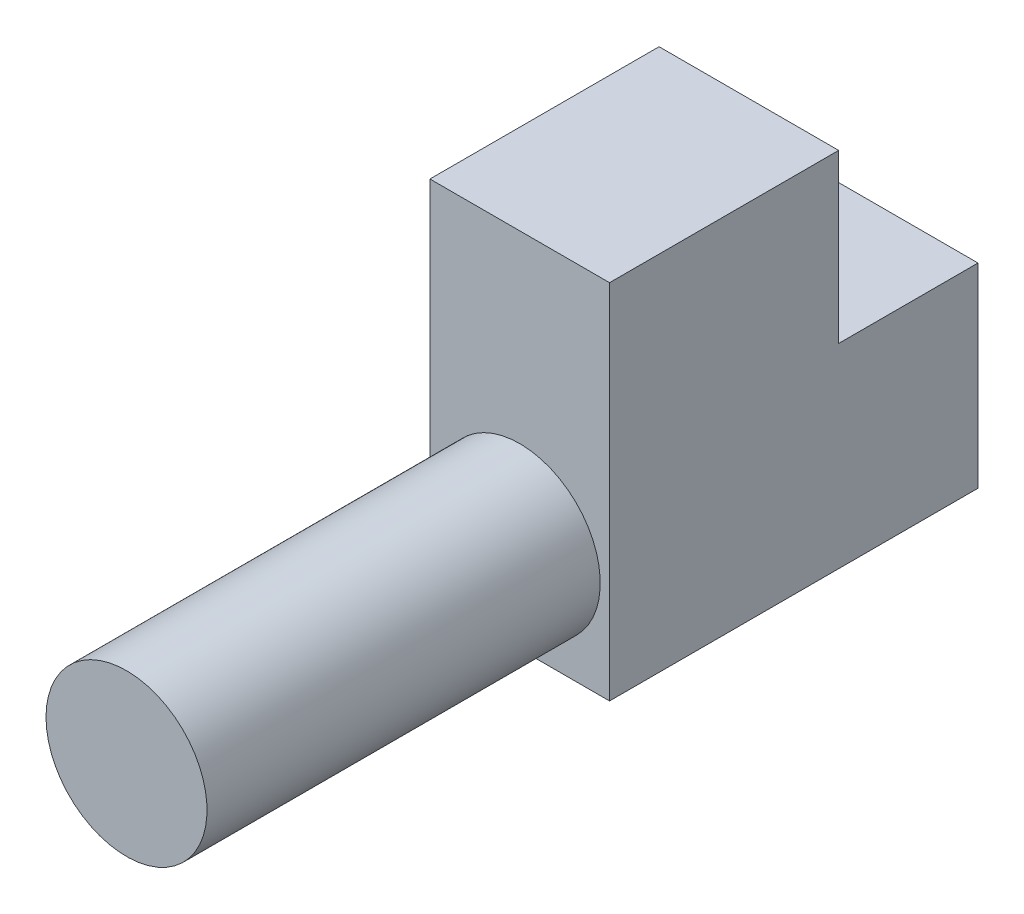
ISO-10303-21;
HEADER;
FILE_DESCRIPTION(('STEP AP214'),'2;1');
FILE_NAME('part.step','',(''),(''),'','','');
FILE_SCHEMA(('AUTOMOTIVE_DESIGN { 1 0 10303 214 1 1 1 1 }'));
ENDSEC;
DATA;
#1=APPLICATION_CONTEXT('core data for automotive mechanical design processes');
#2=APPLICATION_PROTOCOL_DEFINITION('international standard','automotive_design',2000,#1);
#3=PRODUCT_CONTEXT('',#1,'mechanical');
#4=PRODUCT('Part','Part','',(#3));
#5=PRODUCT_RELATED_PRODUCT_CATEGORY('part','',(#4));
#6=PRODUCT_DEFINITION_FORMATION('','',#4);
#7=PRODUCT_DEFINITION_CONTEXT('part definition',#1,'design');
#8=PRODUCT_DEFINITION('design','',#6,#7);
#9=PRODUCT_DEFINITION_SHAPE('','',#8);
#10=(LENGTH_UNIT() NAMED_UNIT(*) SI_UNIT(.MILLI.,.METRE.));
#11=(NAMED_UNIT(*) PLANE_ANGLE_UNIT() SI_UNIT($,.RADIAN.));
#12=(NAMED_UNIT(*) SI_UNIT($,.STERADIAN.) SOLID_ANGLE_UNIT());
#13=UNCERTAINTY_MEASURE_WITH_UNIT(LENGTH_MEASURE(1.E-05),#10,'distance_accuracy_value','');
#14=(GEOMETRIC_REPRESENTATION_CONTEXT(3) GLOBAL_UNCERTAINTY_ASSIGNED_CONTEXT((#13)) GLOBAL_UNIT_ASSIGNED_CONTEXT((#10,
#11,#12)) REPRESENTATION_CONTEXT('',''));
#15=CARTESIAN_POINT('',(0.,0.,0.));
#16=DIRECTION('',(0.,0.,1.));
#17=DIRECTION('',(1.,0.,0.));
#18=AXIS2_PLACEMENT_3D('',#15,#16,#17);
#19=CARTESIAN_POINT('',(-14.5,15.75,59.5));
#20=DIRECTION('',(0.,-1.,0.));
#21=DIRECTION('',(0.,0.,-1.));
#22=AXIS2_PLACEMENT_3D('',#19,#20,#21);
#23=PLANE('',#22);
#24=DIRECTION('',(-1.,0.,0.));
#25=VECTOR('',#24,1.);
#26=CARTESIAN_POINT('',(-14.5,15.75,22.5));
#27=LINE('',#26,#25);
#28=CARTESIAN_POINT('',(14.5,15.75,22.5));
#29=VERTEX_POINT('',#28);
#30=CARTESIAN_POINT('',(-14.5,15.75,22.5));
#31=VERTEX_POINT('',#30);
#32=EDGE_CURVE('E46',#29,#31,#27,.T.);
#33=ORIENTED_EDGE('',*,*,#32,.F.);
#34=DIRECTION('',(0.,0.,-1.));
#35=VECTOR('',#34,1.);
#36=CARTESIAN_POINT('',(14.5,15.75,59.5));
#37=LINE('',#36,#35);
#38=CARTESIAN_POINT('',(14.5,15.75,0.));
#39=VERTEX_POINT('',#38);
#40=EDGE_CURVE('E11',#29,#39,#37,.T.);
#41=ORIENTED_EDGE('',*,*,#40,.T.);
#42=DIRECTION('',(-1.,0.,0.));
#43=VECTOR('',#42,1.);
#44=CARTESIAN_POINT('',(-14.5,15.75,0.));
#45=LINE('',#44,#43);
#46=CARTESIAN_POINT('',(-14.5,15.75,0.));
#47=VERTEX_POINT('',#46);
#48=EDGE_CURVE('E94',#39,#47,#45,.T.);
#49=ORIENTED_EDGE('',*,*,#48,.T.);
#50=DIRECTION('',(0.,0.,-1.));
#51=VECTOR('',#50,1.);
#52=CARTESIAN_POINT('',(-14.5,15.75,59.5));
#53=LINE('',#52,#51);
#54=EDGE_CURVE('E40',#31,#47,#53,.T.);
#55=ORIENTED_EDGE('',*,*,#54,.F.);
#56=EDGE_LOOP('',(#33,#41,#49,#55));
#57=FACE_BOUND('',#56,.T.);
#58=ADVANCED_FACE('F32',(#57),#23,.F.);
#59=CARTESIAN_POINT('',(14.5,-15.75,59.5));
#60=DIRECTION('',(-1.,0.,0.));
#61=DIRECTION('',(0.,0.,1.));
#62=AXIS2_PLACEMENT_3D('',#59,#60,#61);
#63=PLANE('',#62);
#64=DIRECTION('',(0.,1.,0.));
#65=VECTOR('',#64,1.);
#66=CARTESIAN_POINT('',(14.5,-15.75,0.));
#67=LINE('',#66,#65);
#68=CARTESIAN_POINT('',(14.5,-15.75,0.));
#69=VERTEX_POINT('',#68);
#70=EDGE_CURVE('E88',#69,#39,#67,.T.);
#71=ORIENTED_EDGE('',*,*,#70,.T.);
#72=ORIENTED_EDGE('',*,*,#40,.F.);
#73=DIRECTION('',(0.,-1.,0.));
#74=VECTOR('',#73,1.);
#75=CARTESIAN_POINT('',(14.5,42.75,22.5));
#76=LINE('',#75,#74);
#77=CARTESIAN_POINT('',(14.5,42.75,22.5));
#78=VERTEX_POINT('',#77);
#79=EDGE_CURVE('E95',#78,#29,#76,.T.);
#80=ORIENTED_EDGE('',*,*,#79,.F.);
#81=DIRECTION('',(0.,0.,-1.));
#82=VECTOR('',#81,1.);
#83=CARTESIAN_POINT('',(14.5,42.75,59.5));
#84=LINE('',#83,#82);
#85=CARTESIAN_POINT('',(14.5,42.75,59.5));
#86=VERTEX_POINT('',#85);
#87=EDGE_CURVE('E124',#86,#78,#84,.T.);
#88=ORIENTED_EDGE('',*,*,#87,.F.);
#89=DIRECTION('',(0.,1.,0.));
#90=VECTOR('',#89,1.);
#91=CARTESIAN_POINT('',(14.5,-15.75,59.5));
#92=LINE('',#91,#90);
#93=CARTESIAN_POINT('',(14.5,-15.75,59.5));
#94=VERTEX_POINT('',#93);
#95=EDGE_CURVE('E83',#94,#86,#92,.T.);
#96=ORIENTED_EDGE('',*,*,#95,.F.);
#97=DIRECTION('',(0.,0.,-1.));
#98=VECTOR('',#97,1.);
#99=CARTESIAN_POINT('',(14.5,-15.75,59.5));
#100=LINE('',#99,#98);
#101=EDGE_CURVE('E76',#94,#69,#100,.T.);
#102=ORIENTED_EDGE('',*,*,#101,.T.);
#103=EDGE_LOOP('',(#71,#72,#80,#88,#96,#102));
#104=FACE_BOUND('',#103,.T.);
#105=ADVANCED_FACE('F34',(#104),#63,.F.);
#106=CARTESIAN_POINT('',(-14.5,-15.75,59.5));
#107=DIRECTION('',(1.,0.,0.));
#108=DIRECTION('',(0.,0.,-1.));
#109=AXIS2_PLACEMENT_3D('',#106,#107,#108);
#110=PLANE('',#109);
#111=DIRECTION('',(0.,-1.,0.));
#112=VECTOR('',#111,1.);
#113=CARTESIAN_POINT('',(-14.5,-15.75,0.));
#114=LINE('',#113,#112);
#115=CARTESIAN_POINT('',(-14.5,-15.75,0.));
#116=VERTEX_POINT('',#115);
#117=EDGE_CURVE('E84',#47,#116,#114,.T.);
#118=ORIENTED_EDGE('',*,*,#117,.T.);
#119=DIRECTION('',(0.,0.,-1.));
#120=VECTOR('',#119,1.);
#121=CARTESIAN_POINT('',(-14.5,-15.75,59.5));
#122=LINE('',#121,#120);
#123=CARTESIAN_POINT('',(-14.5,-15.75,59.5));
#124=VERTEX_POINT('',#123);
#125=EDGE_CURVE('E79',#124,#116,#122,.T.);
#126=ORIENTED_EDGE('',*,*,#125,.F.);
#127=DIRECTION('',(0.,-1.,0.));
#128=VECTOR('',#127,1.);
#129=CARTESIAN_POINT('',(-14.5,-15.75,59.5));
#130=LINE('',#129,#128);
#131=CARTESIAN_POINT('',(-14.5,42.75,59.5));
#132=VERTEX_POINT('',#131);
#133=EDGE_CURVE('E140',#132,#124,#130,.T.);
#134=ORIENTED_EDGE('',*,*,#133,.F.);
#135=DIRECTION('',(0.,0.,1.));
#136=VECTOR('',#135,1.);
#137=CARTESIAN_POINT('',(-14.5,42.75,59.5));
#138=LINE('',#137,#136);
#139=CARTESIAN_POINT('',(-14.5,42.75,22.5));
#140=VERTEX_POINT('',#139);
#141=EDGE_CURVE('E123',#140,#132,#138,.T.);
#142=ORIENTED_EDGE('',*,*,#141,.F.);
#143=DIRECTION('',(0.,-1.,0.));
#144=VECTOR('',#143,1.);
#145=CARTESIAN_POINT('',(-14.5,42.75,22.5));
#146=LINE('',#145,#144);
#147=EDGE_CURVE('E99',#140,#31,#146,.T.);
#148=ORIENTED_EDGE('',*,*,#147,.T.);
#149=ORIENTED_EDGE('',*,*,#54,.T.);
#150=EDGE_LOOP('',(#118,#126,#134,#142,#148,#149));
#151=FACE_BOUND('',#150,.T.);
#152=ADVANCED_FACE('F107',(#151),#110,.F.);
#153=CARTESIAN_POINT('',(-14.5,-15.75,59.5));
#154=DIRECTION('',(0.,1.,0.));
#155=DIRECTION('',(0.,0.,1.));
#156=AXIS2_PLACEMENT_3D('',#153,#154,#155);
#157=PLANE('',#156);
#158=DIRECTION('',(1.,0.,0.));
#159=VECTOR('',#158,1.);
#160=CARTESIAN_POINT('',(-14.5,-15.75,0.));
#161=LINE('',#160,#159);
#162=EDGE_CURVE('E73',#116,#69,#161,.T.);
#163=ORIENTED_EDGE('',*,*,#162,.T.);
#164=ORIENTED_EDGE('',*,*,#101,.F.);
#165=DIRECTION('',(1.,0.,0.));
#166=VECTOR('',#165,1.);
#167=CARTESIAN_POINT('',(-14.5,-15.75,59.5));
#168=LINE('',#167,#166);
#169=EDGE_CURVE('E55',#124,#94,#168,.T.);
#170=ORIENTED_EDGE('',*,*,#169,.F.);
#171=ORIENTED_EDGE('',*,*,#125,.T.);
#172=EDGE_LOOP('',(#163,#164,#170,#171));
#173=FACE_BOUND('',#172,.T.);
#174=ADVANCED_FACE('F75',(#173),#157,.F.);
#175=CARTESIAN_POINT('',(0.,0.,59.5));
#176=DIRECTION('',(0.,0.,-1.));
#177=DIRECTION('',(-1.,0.,0.));
#178=AXIS2_PLACEMENT_3D('',#175,#176,#177);
#179=PLANE('',#178);
#180=CARTESIAN_POINT('',(0.,0.,59.5));
#181=DIRECTION('',(0.,0.,-1.));
#182=DIRECTION('',(-1.,0.,0.));
#183=AXIS2_PLACEMENT_3D('',#180,#181,#182);
#184=CIRCLE('',#183,13.);
#185=CARTESIAN_POINT('',(-13.,0.,59.5));
#186=VERTEX_POINT('',#185);
#187=EDGE_CURVE('E134',#186,#186,#184,.T.);
#188=ORIENTED_EDGE('',*,*,#187,.T.);
#189=EDGE_LOOP('',(#188));
#190=FACE_BOUND('',#189,.T.);
#191=ORIENTED_EDGE('',*,*,#95,.T.);
#192=DIRECTION('',(1.,0.,0.));
#193=VECTOR('',#192,1.);
#194=CARTESIAN_POINT('',(-14.5,42.75,59.5));
#195=LINE('',#194,#193);
#196=EDGE_CURVE('E129',#132,#86,#195,.T.);
#197=ORIENTED_EDGE('',*,*,#196,.F.);
#198=ORIENTED_EDGE('',*,*,#133,.T.);
#199=ORIENTED_EDGE('',*,*,#169,.T.);
#200=EDGE_LOOP('',(#191,#197,#198,#199));
#201=FACE_BOUND('',#200,.T.);
#202=ADVANCED_FACE('F142',(#190,#201),#179,.F.);
#203=CARTESIAN_POINT('',(0.,0.,0.));
#204=DIRECTION('',(0.,0.,-1.));
#205=DIRECTION('',(-1.,0.,0.));
#206=AXIS2_PLACEMENT_3D('',#203,#204,#205);
#207=PLANE('',#206);
#208=ORIENTED_EDGE('',*,*,#70,.F.);
#209=ORIENTED_EDGE('',*,*,#162,.F.);
#210=ORIENTED_EDGE('',*,*,#117,.F.);
#211=ORIENTED_EDGE('',*,*,#48,.F.);
#212=EDGE_LOOP('',(#208,#209,#210,#211));
#213=FACE_BOUND('',#212,.T.);
#214=ADVANCED_FACE('F92',(#213),#207,.T.);
#215=CARTESIAN_POINT('',(-14.5,42.75,22.5));
#216=DIRECTION('',(0.,0.,1.));
#217=DIRECTION('',(1.,0.,0.));
#218=AXIS2_PLACEMENT_3D('',#215,#216,#217);
#219=PLANE('',#218);
#220=ORIENTED_EDGE('',*,*,#32,.T.);
#221=ORIENTED_EDGE('',*,*,#147,.F.);
#222=DIRECTION('',(-1.,0.,0.));
#223=VECTOR('',#222,1.);
#224=CARTESIAN_POINT('',(-14.5,42.75,22.5));
#225=LINE('',#224,#223);
#226=EDGE_CURVE('E117',#78,#140,#225,.T.);
#227=ORIENTED_EDGE('',*,*,#226,.F.);
#228=ORIENTED_EDGE('',*,*,#79,.T.);
#229=EDGE_LOOP('',(#220,#221,#227,#228));
#230=FACE_BOUND('',#229,.T.);
#231=ADVANCED_FACE('F115',(#230),#219,.F.);
#232=CARTESIAN_POINT('',(0.,42.75,0.));
#233=DIRECTION('',(0.,1.,0.));
#234=DIRECTION('',(0.,0.,1.));
#235=AXIS2_PLACEMENT_3D('',#232,#233,#234);
#236=PLANE('',#235);
#237=ORIENTED_EDGE('',*,*,#87,.T.);
#238=ORIENTED_EDGE('',*,*,#226,.T.);
#239=ORIENTED_EDGE('',*,*,#141,.T.);
#240=ORIENTED_EDGE('',*,*,#196,.T.);
#241=EDGE_LOOP('',(#237,#238,#239,#240));
#242=FACE_BOUND('',#241,.T.);
#243=ADVANCED_FACE('F127',(#242),#236,.T.);
#244=CARTESIAN_POINT('',(0.,0.,123.));
#245=DIRECTION('',(0.,0.,-1.));
#246=DIRECTION('',(-1.,0.,0.));
#247=AXIS2_PLACEMENT_3D('',#244,#245,#246);
#248=CYLINDRICAL_SURFACE('',#247,13.);
#249=CARTESIAN_POINT('',(0.,0.,123.));
#250=DIRECTION('',(0.,0.,-1.));
#251=DIRECTION('',(-1.,0.,0.));
#252=AXIS2_PLACEMENT_3D('',#249,#250,#251);
#253=CIRCLE('',#252,13.);
#254=CARTESIAN_POINT('',(-13.,0.,123.));
#255=VERTEX_POINT('',#254);
#256=EDGE_CURVE('E131',#255,#255,#253,.T.);
#257=ORIENTED_EDGE('',*,*,#256,.T.);
#258=EDGE_LOOP('',(#257));
#259=FACE_BOUND('',#258,.T.);
#260=ORIENTED_EDGE('',*,*,#187,.F.);
#261=EDGE_LOOP('',(#260));
#262=FACE_BOUND('',#261,.T.);
#263=ADVANCED_FACE('F218',(#259,#262),#248,.T.);
#264=CARTESIAN_POINT('',(0.,0.,123.));
#265=DIRECTION('',(0.,0.,-1.));
#266=DIRECTION('',(-1.,0.,0.));
#267=AXIS2_PLACEMENT_3D('',#264,#265,#266);
#268=PLANE('',#267);
#269=ORIENTED_EDGE('',*,*,#256,.F.);
#270=EDGE_LOOP('',(#269));
#271=FACE_BOUND('',#270,.T.);
#272=ADVANCED_FACE('F225',(#271),#268,.F.);
#273=CLOSED_SHELL('',(#58,#105,#152,#174,#202,#214,#231,#243,#263,#272));
#274=MANIFOLD_SOLID_BREP('B2',#273);
#275=ADVANCED_BREP_SHAPE_REPRESENTATION('',(#18,#274),#14);
#276=SHAPE_DEFINITION_REPRESENTATION(#9,#275);
ENDSEC;
END-ISO-10303-21;
